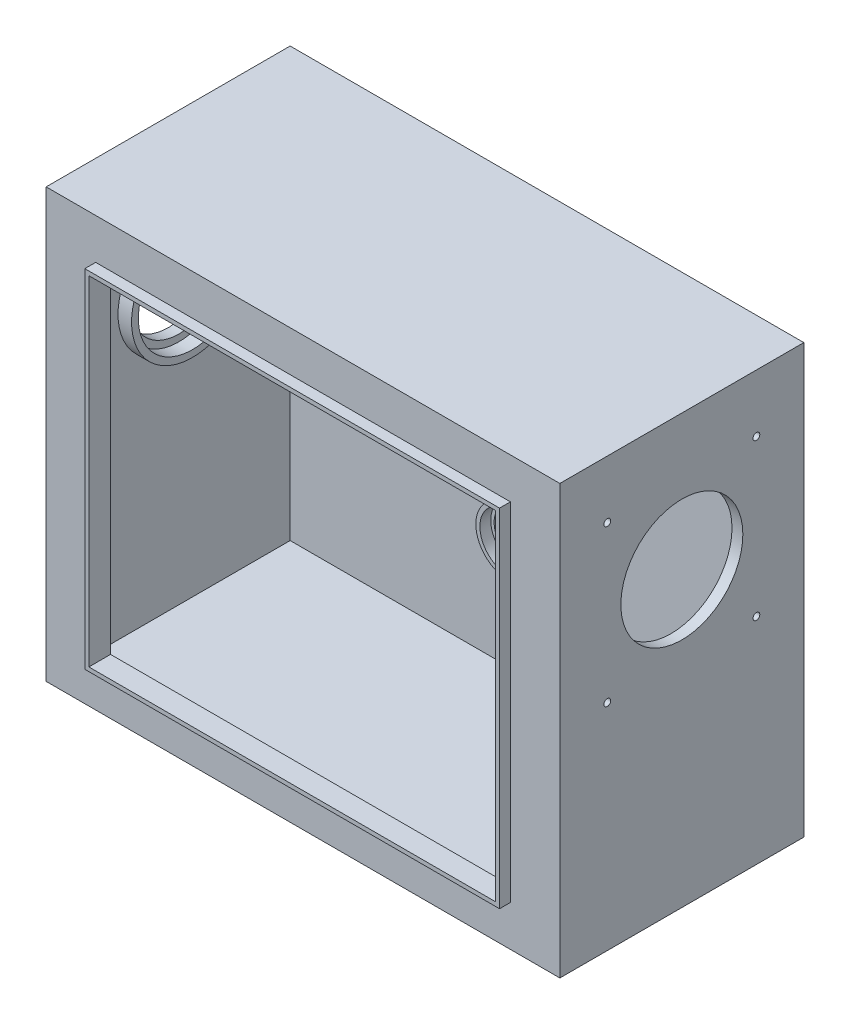
ISO-10303-21;
HEADER;
FILE_DESCRIPTION(('STEP AP214'),'2;1');
FILE_NAME('part.step','',(''),(''),'','','');
FILE_SCHEMA(('AUTOMOTIVE_DESIGN { 1 0 10303 214 1 1 1 1 }'));
ENDSEC;
DATA;
#1=APPLICATION_CONTEXT('core data for automotive mechanical design processes');
#2=APPLICATION_PROTOCOL_DEFINITION('international standard','automotive_design',2000,#1);
#3=PRODUCT_CONTEXT('',#1,'mechanical');
#4=PRODUCT('Part','Part','',(#3));
#5=PRODUCT_RELATED_PRODUCT_CATEGORY('part','',(#4));
#6=PRODUCT_DEFINITION_FORMATION('','',#4);
#7=PRODUCT_DEFINITION_CONTEXT('part definition',#1,'design');
#8=PRODUCT_DEFINITION('design','',#6,#7);
#9=PRODUCT_DEFINITION_SHAPE('','',#8);
#10=(LENGTH_UNIT() NAMED_UNIT(*) SI_UNIT(.MILLI.,.METRE.));
#11=(NAMED_UNIT(*) PLANE_ANGLE_UNIT() SI_UNIT($,.RADIAN.));
#12=(NAMED_UNIT(*) SI_UNIT($,.STERADIAN.) SOLID_ANGLE_UNIT());
#13=UNCERTAINTY_MEASURE_WITH_UNIT(LENGTH_MEASURE(1.E-05),#10,'distance_accuracy_value','');
#14=(GEOMETRIC_REPRESENTATION_CONTEXT(3) GLOBAL_UNCERTAINTY_ASSIGNED_CONTEXT((#13)) GLOBAL_UNIT_ASSIGNED_CONTEXT((#10,
#11,#12)) REPRESENTATION_CONTEXT('',''));
#15=CARTESIAN_POINT('',(0.,0.,0.));
#16=DIRECTION('',(0.,0.,1.));
#17=DIRECTION('',(1.,0.,0.));
#18=AXIS2_PLACEMENT_3D('',#15,#16,#17);
#19=CARTESIAN_POINT('',(-189.5,-158.,180.));
#20=DIRECTION('',(1.,0.,0.));
#21=DIRECTION('',(0.,0.,-1.));
#22=AXIS2_PLACEMENT_3D('',#19,#20,#21);
#23=PLANE('',#22);
#24=CARTESIAN_POINT('',(-189.5,115.5,145.));
#25=DIRECTION('',(-1.,0.,0.));
#26=DIRECTION('',(0.,0.,1.));
#27=AXIS2_PLACEMENT_3D('',#24,#25,#26);
#28=CIRCLE('',#27,2.49999999999999);
#29=CARTESIAN_POINT('',(-189.5,115.5,147.5));
#30=VERTEX_POINT('',#29);
#31=EDGE_CURVE('E331',#30,#30,#28,.T.);
#32=ORIENTED_EDGE('',*,*,#31,.F.);
#33=EDGE_LOOP('',(#32));
#34=FACE_BOUND('',#33,.T.);
#35=CARTESIAN_POINT('',(-189.5,0.49999999999991,145.));
#36=DIRECTION('',(-1.,0.,0.));
#37=DIRECTION('',(0.,0.,1.));
#38=AXIS2_PLACEMENT_3D('',#35,#36,#37);
#39=CIRCLE('',#38,2.49999999999999);
#40=CARTESIAN_POINT('',(-189.5,0.49999999999991,147.5));
#41=VERTEX_POINT('',#40);
#42=EDGE_CURVE('E328',#41,#41,#39,.T.);
#43=ORIENTED_EDGE('',*,*,#42,.F.);
#44=EDGE_LOOP('',(#43));
#45=FACE_BOUND('',#44,.T.);
#46=CARTESIAN_POINT('',(-189.5,0.49999999999991,35.));
#47=DIRECTION('',(-1.,0.,0.));
#48=DIRECTION('',(0.,0.,1.));
#49=AXIS2_PLACEMENT_3D('',#46,#47,#48);
#50=CIRCLE('',#49,2.49999999999999);
#51=CARTESIAN_POINT('',(-189.5,0.49999999999991,37.5));
#52=VERTEX_POINT('',#51);
#53=EDGE_CURVE('E346',#52,#52,#50,.T.);
#54=ORIENTED_EDGE('',*,*,#53,.F.);
#55=EDGE_LOOP('',(#54));
#56=FACE_BOUND('',#55,.T.);
#57=CARTESIAN_POINT('',(-189.5,57.9999999999999,90.));
#58=DIRECTION('',(-1.,0.,0.));
#59=DIRECTION('',(0.,0.,1.));
#60=AXIS2_PLACEMENT_3D('',#57,#58,#59);
#61=CIRCLE('',#60,35.);
#62=CARTESIAN_POINT('',(-189.5,57.9999999999999,125.));
#63=VERTEX_POINT('',#62);
#64=EDGE_CURVE('E247',#63,#63,#61,.T.);
#65=ORIENTED_EDGE('',*,*,#64,.F.);
#66=EDGE_LOOP('',(#65));
#67=FACE_BOUND('',#66,.T.);
#68=DIRECTION('',(0.,-1.,0.));
#69=VECTOR('',#68,1.);
#70=CARTESIAN_POINT('',(-189.5,-158.,0.));
#71=LINE('',#70,#69);
#72=CARTESIAN_POINT('',(-189.5,158.,0.));
#73=VERTEX_POINT('',#72);
#74=CARTESIAN_POINT('',(-189.5,-158.,0.));
#75=VERTEX_POINT('',#74);
#76=EDGE_CURVE('E259',#73,#75,#71,.T.);
#77=ORIENTED_EDGE('',*,*,#76,.T.);
#78=DIRECTION('',(0.,0.,-1.));
#79=VECTOR('',#78,1.);
#80=CARTESIAN_POINT('',(-189.5,-158.,180.));
#81=LINE('',#80,#79);
#82=CARTESIAN_POINT('',(-189.5,-158.,180.));
#83=VERTEX_POINT('',#82);
#84=EDGE_CURVE('E300',#83,#75,#81,.T.);
#85=ORIENTED_EDGE('',*,*,#84,.F.);
#86=DIRECTION('',(0.,-1.,0.));
#87=VECTOR('',#86,1.);
#88=CARTESIAN_POINT('',(-189.5,-158.,180.));
#89=LINE('',#88,#87);
#90=CARTESIAN_POINT('',(-189.5,158.,180.));
#91=VERTEX_POINT('',#90);
#92=EDGE_CURVE('E274',#91,#83,#89,.T.);
#93=ORIENTED_EDGE('',*,*,#92,.F.);
#94=DIRECTION('',(0.,0.,-1.));
#95=VECTOR('',#94,1.);
#96=CARTESIAN_POINT('',(-189.5,158.,180.));
#97=LINE('',#96,#95);
#98=EDGE_CURVE('E284',#91,#73,#97,.T.);
#99=ORIENTED_EDGE('',*,*,#98,.T.);
#100=EDGE_LOOP('',(#77,#85,#93,#99));
#101=FACE_BOUND('',#100,.T.);
#102=CARTESIAN_POINT('',(-189.5,115.5,35.));
#103=DIRECTION('',(-1.,0.,0.));
#104=DIRECTION('',(0.,0.,1.));
#105=AXIS2_PLACEMENT_3D('',#102,#103,#104);
#106=CIRCLE('',#105,2.49999999999999);
#107=CARTESIAN_POINT('',(-189.5,115.5,37.5));
#108=VERTEX_POINT('',#107);
#109=EDGE_CURVE('E398',#108,#108,#106,.T.);
#110=ORIENTED_EDGE('',*,*,#109,.F.);
#111=EDGE_LOOP('',(#110));
#112=FACE_BOUND('',#111,.T.);
#113=ADVANCED_FACE('F37',(#34,#45,#56,#67,#101,#112),#23,.F.);
#114=CARTESIAN_POINT('',(0.,0.,180.));
#115=DIRECTION('',(0.,0.,-1.));
#116=DIRECTION('',(-1.,0.,0.));
#117=AXIS2_PLACEMENT_3D('',#114,#115,#116);
#118=PLANE('',#117);
#119=ORIENTED_EDGE('',*,*,#92,.T.);
#120=DIRECTION('',(1.,0.,0.));
#121=VECTOR('',#120,1.);
#122=CARTESIAN_POINT('',(-189.5,-158.,180.));
#123=LINE('',#122,#121);
#124=CARTESIAN_POINT('',(189.5,-158.,180.));
#125=VERTEX_POINT('',#124);
#126=EDGE_CURVE('E277',#83,#125,#123,.T.);
#127=ORIENTED_EDGE('',*,*,#126,.T.);
#128=DIRECTION('',(0.,1.,0.));
#129=VECTOR('',#128,1.);
#130=CARTESIAN_POINT('',(189.5,-158.,180.));
#131=LINE('',#130,#129);
#132=CARTESIAN_POINT('',(189.5,158.,180.));
#133=VERTEX_POINT('',#132);
#134=EDGE_CURVE('E280',#125,#133,#131,.T.);
#135=ORIENTED_EDGE('',*,*,#134,.T.);
#136=DIRECTION('',(-1.,0.,0.));
#137=VECTOR('',#136,1.);
#138=CARTESIAN_POINT('',(-189.5,158.,180.));
#139=LINE('',#138,#137);
#140=EDGE_CURVE('E282',#133,#91,#139,.T.);
#141=ORIENTED_EDGE('',*,*,#140,.T.);
#142=EDGE_LOOP('',(#119,#127,#135,#141));
#143=FACE_BOUND('',#142,.T.);
#144=DIRECTION('',(0.,-1.,0.));
#145=VECTOR('',#144,1.);
#146=CARTESIAN_POINT('',(-153.,-128.,180.));
#147=LINE('',#146,#145);
#148=CARTESIAN_POINT('',(-153.,128.,180.));
#149=VERTEX_POINT('',#148);
#150=CARTESIAN_POINT('',(-153.,-128.,180.));
#151=VERTEX_POINT('',#150);
#152=EDGE_CURVE('E180',#149,#151,#147,.T.);
#153=ORIENTED_EDGE('',*,*,#152,.F.);
#154=DIRECTION('',(-1.,0.,0.));
#155=VECTOR('',#154,1.);
#156=CARTESIAN_POINT('',(153.,128.,180.));
#157=LINE('',#156,#155);
#158=CARTESIAN_POINT('',(153.,128.,180.));
#159=VERTEX_POINT('',#158);
#160=EDGE_CURVE('E185',#159,#149,#157,.T.);
#161=ORIENTED_EDGE('',*,*,#160,.F.);
#162=DIRECTION('',(0.,1.,0.));
#163=VECTOR('',#162,1.);
#164=CARTESIAN_POINT('',(153.,-128.,180.));
#165=LINE('',#164,#163);
#166=CARTESIAN_POINT('',(153.,-128.,180.));
#167=VERTEX_POINT('',#166);
#168=EDGE_CURVE('E58',#167,#159,#165,.T.);
#169=ORIENTED_EDGE('',*,*,#168,.F.);
#170=DIRECTION('',(1.,0.,0.));
#171=VECTOR('',#170,1.);
#172=CARTESIAN_POINT('',(153.,-128.,180.));
#173=LINE('',#172,#171);
#174=EDGE_CURVE('E53',#151,#167,#173,.T.);
#175=ORIENTED_EDGE('',*,*,#174,.F.);
#176=EDGE_LOOP('',(#153,#161,#169,#175));
#177=FACE_BOUND('',#176,.T.);
#178=ADVANCED_FACE('F377',(#143,#177),#118,.F.);
#179=CARTESIAN_POINT('',(-181.5,-158.,180.));
#180=DIRECTION('',(1.,0.,0.));
#181=DIRECTION('',(0.,0.,-1.));
#182=AXIS2_PLACEMENT_3D('',#179,#180,#181);
#183=PLANE('',#182);
#184=CARTESIAN_POINT('',(-181.5,57.9999999999999,90.));
#185=DIRECTION('',(1.,0.,0.));
#186=DIRECTION('',(0.,0.,-1.));
#187=AXIS2_PLACEMENT_3D('',#184,#185,#186);
#188=CIRCLE('',#187,35.);
#189=CARTESIAN_POINT('',(-181.5,57.9999999999999,55.));
#190=VERTEX_POINT('',#189);
#191=EDGE_CURVE('E252',#190,#190,#188,.T.);
#192=ORIENTED_EDGE('',*,*,#191,.F.);
#193=EDGE_LOOP('',(#192));
#194=FACE_BOUND('',#193,.T.);
#195=CARTESIAN_POINT('',(-181.5,57.9999999999999,90.));
#196=DIRECTION('',(1.,0.,0.));
#197=DIRECTION('',(0.,0.,-1.));
#198=AXIS2_PLACEMENT_3D('',#195,#196,#197);
#199=CIRCLE('',#198,40.);
#200=CARTESIAN_POINT('',(-181.5,57.9999999999999,50.));
#201=VERTEX_POINT('',#200);
#202=EDGE_CURVE('E303',#201,#201,#199,.F.);
#203=ORIENTED_EDGE('',*,*,#202,.F.);
#204=EDGE_LOOP('',(#203));
#205=FACE_BOUND('',#204,.T.);
#206=ADVANCED_FACE('F382',(#194,#205),#183,.T.);
#207=CARTESIAN_POINT('',(-189.5,-158.,180.));
#208=DIRECTION('',(0.,1.,0.));
#209=DIRECTION('',(0.,0.,1.));
#210=AXIS2_PLACEMENT_3D('',#207,#208,#209);
#211=PLANE('',#210);
#212=DIRECTION('',(1.,0.,0.));
#213=VECTOR('',#212,1.);
#214=CARTESIAN_POINT('',(-189.5,-158.,0.));
#215=LINE('',#214,#213);
#216=CARTESIAN_POINT('',(189.5,-158.,0.));
#217=VERTEX_POINT('',#216);
#218=EDGE_CURVE('E287',#75,#217,#215,.T.);
#219=ORIENTED_EDGE('',*,*,#218,.T.);
#220=DIRECTION('',(0.,0.,-1.));
#221=VECTOR('',#220,1.);
#222=CARTESIAN_POINT('',(189.5,-158.,180.));
#223=LINE('',#222,#221);
#224=EDGE_CURVE('E297',#125,#217,#223,.T.);
#225=ORIENTED_EDGE('',*,*,#224,.F.);
#226=ORIENTED_EDGE('',*,*,#126,.F.);
#227=ORIENTED_EDGE('',*,*,#84,.T.);
#228=EDGE_LOOP('',(#219,#225,#226,#227));
#229=FACE_BOUND('',#228,.T.);
#230=ADVANCED_FACE('F442',(#229),#211,.F.);
#231=CARTESIAN_POINT('',(189.5,-158.,180.));
#232=DIRECTION('',(-1.,0.,0.));
#233=DIRECTION('',(0.,0.,1.));
#234=AXIS2_PLACEMENT_3D('',#231,#232,#233);
#235=PLANE('',#234);
#236=CARTESIAN_POINT('',(189.5,115.5,35.));
#237=DIRECTION('',(-1.,0.,0.));
#238=DIRECTION('',(0.,0.,1.));
#239=AXIS2_PLACEMENT_3D('',#236,#237,#238);
#240=CIRCLE('',#239,2.49999999999995);
#241=CARTESIAN_POINT('',(189.5,115.5,37.4999999999999));
#242=VERTEX_POINT('',#241);
#243=EDGE_CURVE('E400',#242,#242,#240,.T.);
#244=ORIENTED_EDGE('',*,*,#243,.T.);
#245=EDGE_LOOP('',(#244));
#246=FACE_BOUND('',#245,.T.);
#247=CARTESIAN_POINT('',(189.5,115.5,145.));
#248=DIRECTION('',(-1.,0.,0.));
#249=DIRECTION('',(0.,0.,1.));
#250=AXIS2_PLACEMENT_3D('',#247,#248,#249);
#251=CIRCLE('',#250,2.49999999999995);
#252=CARTESIAN_POINT('',(189.5,115.5,147.5));
#253=VERTEX_POINT('',#252);
#254=EDGE_CURVE('E324',#253,#253,#251,.T.);
#255=ORIENTED_EDGE('',*,*,#254,.T.);
#256=EDGE_LOOP('',(#255));
#257=FACE_BOUND('',#256,.T.);
#258=CARTESIAN_POINT('',(189.5,0.49999999999991,145.));
#259=DIRECTION('',(-1.,0.,0.));
#260=DIRECTION('',(0.,0.,1.));
#261=AXIS2_PLACEMENT_3D('',#258,#259,#260);
#262=CIRCLE('',#261,2.49999999999995);
#263=CARTESIAN_POINT('',(189.5,0.49999999999991,147.5));
#264=VERTEX_POINT('',#263);
#265=EDGE_CURVE('E320',#264,#264,#262,.T.);
#266=ORIENTED_EDGE('',*,*,#265,.T.);
#267=EDGE_LOOP('',(#266));
#268=FACE_BOUND('',#267,.T.);
#269=CARTESIAN_POINT('',(189.5,0.49999999999991,35.));
#270=DIRECTION('',(-1.,0.,0.));
#271=DIRECTION('',(0.,0.,1.));
#272=AXIS2_PLACEMENT_3D('',#269,#270,#271);
#273=CIRCLE('',#272,2.49999999999995);
#274=CARTESIAN_POINT('',(189.5,0.49999999999991,37.4999999999999));
#275=VERTEX_POINT('',#274);
#276=EDGE_CURVE('E316',#275,#275,#273,.T.);
#277=ORIENTED_EDGE('',*,*,#276,.T.);
#278=EDGE_LOOP('',(#277));
#279=FACE_BOUND('',#278,.T.);
#280=CARTESIAN_POINT('',(189.5,58.,90.));
#281=DIRECTION('',(1.,0.,0.));
#282=DIRECTION('',(0.,0.,-1.));
#283=AXIS2_PLACEMENT_3D('',#280,#281,#282);
#284=CIRCLE('',#283,45.);
#285=CARTESIAN_POINT('',(189.5,58.,45.));
#286=VERTEX_POINT('',#285);
#287=EDGE_CURVE('E236',#286,#286,#284,.T.);
#288=ORIENTED_EDGE('',*,*,#287,.F.);
#289=EDGE_LOOP('',(#288));
#290=FACE_BOUND('',#289,.T.);
#291=DIRECTION('',(0.,1.,0.));
#292=VECTOR('',#291,1.);
#293=CARTESIAN_POINT('',(189.5,-158.,0.));
#294=LINE('',#293,#292);
#295=CARTESIAN_POINT('',(189.5,158.,0.));
#296=VERTEX_POINT('',#295);
#297=EDGE_CURVE('E289',#217,#296,#294,.T.);
#298=ORIENTED_EDGE('',*,*,#297,.T.);
#299=DIRECTION('',(0.,0.,-1.));
#300=VECTOR('',#299,1.);
#301=CARTESIAN_POINT('',(189.5,158.,180.));
#302=LINE('',#301,#300);
#303=EDGE_CURVE('E294',#133,#296,#302,.T.);
#304=ORIENTED_EDGE('',*,*,#303,.F.);
#305=ORIENTED_EDGE('',*,*,#134,.F.);
#306=ORIENTED_EDGE('',*,*,#224,.T.);
#307=EDGE_LOOP('',(#298,#304,#305,#306));
#308=FACE_BOUND('',#307,.T.);
#309=ADVANCED_FACE('F438',(#246,#257,#268,#279,#290,#308),#235,.F.);
#310=CARTESIAN_POINT('',(-189.5,158.,180.));
#311=DIRECTION('',(0.,-1.,0.));
#312=DIRECTION('',(0.,0.,-1.));
#313=AXIS2_PLACEMENT_3D('',#310,#311,#312);
#314=PLANE('',#313);
#315=DIRECTION('',(-1.,0.,0.));
#316=VECTOR('',#315,1.);
#317=CARTESIAN_POINT('',(-189.5,158.,0.));
#318=LINE('',#317,#316);
#319=EDGE_CURVE('E278',#296,#73,#318,.T.);
#320=ORIENTED_EDGE('',*,*,#319,.T.);
#321=ORIENTED_EDGE('',*,*,#98,.F.);
#322=ORIENTED_EDGE('',*,*,#140,.F.);
#323=ORIENTED_EDGE('',*,*,#303,.T.);
#324=EDGE_LOOP('',(#320,#321,#322,#323));
#325=FACE_BOUND('',#324,.T.);
#326=ADVANCED_FACE('F441',(#325),#314,.F.);
#327=CARTESIAN_POINT('',(0.,0.,0.));
#328=DIRECTION('',(0.,0.,-1.));
#329=DIRECTION('',(-1.,0.,0.));
#330=AXIS2_PLACEMENT_3D('',#327,#328,#329);
#331=PLANE('',#330);
#332=ORIENTED_EDGE('',*,*,#76,.F.);
#333=ORIENTED_EDGE('',*,*,#319,.F.);
#334=ORIENTED_EDGE('',*,*,#297,.F.);
#335=ORIENTED_EDGE('',*,*,#218,.F.);
#336=EDGE_LOOP('',(#332,#333,#334,#335));
#337=FACE_BOUND('',#336,.T.);
#338=ADVANCED_FACE('F454',(#337),#331,.T.);
#339=CARTESIAN_POINT('',(-181.5,115.5,35.));
#340=DIRECTION('',(1.,0.,0.));
#341=DIRECTION('',(0.,0.,-1.));
#342=AXIS2_PLACEMENT_3D('',#339,#340,#341);
#343=CIRCLE('',#342,2.49999999999997);
#344=CARTESIAN_POINT('',(-181.5,115.5,32.5));
#345=VERTEX_POINT('',#344);
#346=EDGE_CURVE('E336',#345,#345,#343,.T.);
#347=ORIENTED_EDGE('',*,*,#346,.F.);
#348=EDGE_LOOP('',(#347));
#349=FACE_BOUND('',#348,.T.);
#350=CARTESIAN_POINT('',(-181.5,115.5,145.));
#351=DIRECTION('',(1.,0.,0.));
#352=DIRECTION('',(0.,0.,-1.));
#353=AXIS2_PLACEMENT_3D('',#350,#351,#352);
#354=CIRCLE('',#353,2.49999999999997);
#355=CARTESIAN_POINT('',(-181.5,115.5,142.5));
#356=VERTEX_POINT('',#355);
#357=EDGE_CURVE('E323',#356,#356,#354,.T.);
#358=ORIENTED_EDGE('',*,*,#357,.F.);
#359=EDGE_LOOP('',(#358));
#360=FACE_BOUND('',#359,.T.);
#361=CARTESIAN_POINT('',(-181.5,0.49999999999991,145.));
#362=DIRECTION('',(1.,0.,0.));
#363=DIRECTION('',(0.,0.,-1.));
#364=AXIS2_PLACEMENT_3D('',#361,#362,#363);
#365=CIRCLE('',#364,2.49999999999997);
#366=CARTESIAN_POINT('',(-181.5,0.49999999999991,142.5));
#367=VERTEX_POINT('',#366);
#368=EDGE_CURVE('E319',#367,#367,#365,.T.);
#369=ORIENTED_EDGE('',*,*,#368,.F.);
#370=EDGE_LOOP('',(#369));
#371=FACE_BOUND('',#370,.T.);
#372=CARTESIAN_POINT('',(-181.5,0.49999999999991,35.));
#373=DIRECTION('',(1.,0.,0.));
#374=DIRECTION('',(0.,0.,-1.));
#375=AXIS2_PLACEMENT_3D('',#372,#373,#374);
#376=CIRCLE('',#375,2.49999999999997);
#377=CARTESIAN_POINT('',(-181.5,0.49999999999991,32.5));
#378=VERTEX_POINT('',#377);
#379=EDGE_CURVE('E315',#378,#378,#376,.T.);
#380=ORIENTED_EDGE('',*,*,#379,.F.);
#381=EDGE_LOOP('',(#380));
#382=FACE_BOUND('',#381,.T.);
#383=DIRECTION('',(0.,-1.,0.));
#384=VECTOR('',#383,1.);
#385=CARTESIAN_POINT('',(-181.5,150.,172.));
#386=LINE('',#385,#384);
#387=CARTESIAN_POINT('',(-181.5,150.,172.));
#388=VERTEX_POINT('',#387);
#389=CARTESIAN_POINT('',(-181.5,-150.,172.));
#390=VERTEX_POINT('',#389);
#391=EDGE_CURVE('E218',#388,#390,#386,.T.);
#392=ORIENTED_EDGE('',*,*,#391,.T.);
#393=DIRECTION('',(0.,0.,-1.));
#394=VECTOR('',#393,1.);
#395=CARTESIAN_POINT('',(-181.5,-150.,180.));
#396=LINE('',#395,#394);
#397=CARTESIAN_POINT('',(-181.5,-150.,8.));
#398=VERTEX_POINT('',#397);
#399=EDGE_CURVE('E257',#390,#398,#396,.T.);
#400=ORIENTED_EDGE('',*,*,#399,.T.);
#401=DIRECTION('',(0.,-1.,0.));
#402=VECTOR('',#401,1.);
#403=CARTESIAN_POINT('',(-181.5,0.,8.));
#404=LINE('',#403,#402);
#405=CARTESIAN_POINT('',(-181.5,150.,8.));
#406=VERTEX_POINT('',#405);
#407=EDGE_CURVE('E253',#406,#398,#404,.T.);
#408=ORIENTED_EDGE('',*,*,#407,.F.);
#409=DIRECTION('',(0.,0.,-1.));
#410=VECTOR('',#409,1.);
#411=CARTESIAN_POINT('',(-181.5,150.,180.));
#412=LINE('',#411,#410);
#413=EDGE_CURVE('E261',#388,#406,#412,.T.);
#414=ORIENTED_EDGE('',*,*,#413,.F.);
#415=EDGE_LOOP('',(#392,#400,#408,#414));
#416=FACE_BOUND('',#415,.T.);
#417=CARTESIAN_POINT('',(-181.5,57.9999999999999,90.));
#418=DIRECTION('',(1.,0.,0.));
#419=DIRECTION('',(0.,0.,-1.));
#420=AXIS2_PLACEMENT_3D('',#417,#418,#419);
#421=CIRCLE('',#420,45.);
#422=CARTESIAN_POINT('',(-181.5,57.9999999999999,45.));
#423=VERTEX_POINT('',#422);
#424=EDGE_CURVE('E243',#423,#423,#421,.T.);
#425=ORIENTED_EDGE('',*,*,#424,.F.);
#426=EDGE_LOOP('',(#425));
#427=FACE_BOUND('',#426,.T.);
#428=ADVANCED_FACE('F524',(#349,#360,#371,#382,#416,#427),#183,.T.);
#429=CARTESIAN_POINT('',(-189.5,-150.,180.));
#430=DIRECTION('',(0.,1.,0.));
#431=DIRECTION('',(0.,0.,1.));
#432=AXIS2_PLACEMENT_3D('',#429,#430,#431);
#433=PLANE('',#432);
#434=DIRECTION('',(1.,0.,0.));
#435=VECTOR('',#434,1.);
#436=CARTESIAN_POINT('',(181.5,-150.,172.));
#437=LINE('',#436,#435);
#438=CARTESIAN_POINT('',(181.5,-150.,172.));
#439=VERTEX_POINT('',#438);
#440=EDGE_CURVE('E223',#390,#439,#437,.T.);
#441=ORIENTED_EDGE('',*,*,#440,.T.);
#442=DIRECTION('',(0.,0.,-1.));
#443=VECTOR('',#442,1.);
#444=CARTESIAN_POINT('',(181.5,-150.,180.));
#445=LINE('',#444,#443);
#446=CARTESIAN_POINT('',(181.5,-150.,8.));
#447=VERTEX_POINT('',#446);
#448=EDGE_CURVE('E260',#439,#447,#445,.T.);
#449=ORIENTED_EDGE('',*,*,#448,.T.);
#450=DIRECTION('',(1.,0.,0.));
#451=VECTOR('',#450,1.);
#452=CARTESIAN_POINT('',(0.,-150.,8.));
#453=LINE('',#452,#451);
#454=EDGE_CURVE('E256',#398,#447,#453,.T.);
#455=ORIENTED_EDGE('',*,*,#454,.F.);
#456=ORIENTED_EDGE('',*,*,#399,.F.);
#457=EDGE_LOOP('',(#441,#449,#455,#456));
#458=FACE_BOUND('',#457,.T.);
#459=ADVANCED_FACE('F417',(#458),#433,.T.);
#460=CARTESIAN_POINT('',(181.5,-158.,180.));
#461=DIRECTION('',(-1.,0.,0.));
#462=DIRECTION('',(0.,0.,1.));
#463=AXIS2_PLACEMENT_3D('',#460,#461,#462);
#464=PLANE('',#463);
#465=CARTESIAN_POINT('',(181.5,115.5,35.));
#466=DIRECTION('',(-1.,0.,0.));
#467=DIRECTION('',(0.,0.,1.));
#468=AXIS2_PLACEMENT_3D('',#465,#466,#467);
#469=CIRCLE('',#468,2.49999999999997);
#470=CARTESIAN_POINT('',(181.5,115.5,37.5));
#471=VERTEX_POINT('',#470);
#472=EDGE_CURVE('E40',#471,#471,#469,.T.);
#473=ORIENTED_EDGE('',*,*,#472,.F.);
#474=EDGE_LOOP('',(#473));
#475=FACE_BOUND('',#474,.T.);
#476=CARTESIAN_POINT('',(181.5,115.5,145.));
#477=DIRECTION('',(-1.,0.,0.));
#478=DIRECTION('',(0.,0.,1.));
#479=AXIS2_PLACEMENT_3D('',#476,#477,#478);
#480=CIRCLE('',#479,2.49999999999997);
#481=CARTESIAN_POINT('',(181.5,115.5,147.5));
#482=VERTEX_POINT('',#481);
#483=EDGE_CURVE('E321',#482,#482,#480,.T.);
#484=ORIENTED_EDGE('',*,*,#483,.F.);
#485=EDGE_LOOP('',(#484));
#486=FACE_BOUND('',#485,.T.);
#487=CARTESIAN_POINT('',(181.5,0.49999999999991,145.));
#488=DIRECTION('',(-1.,0.,0.));
#489=DIRECTION('',(0.,0.,1.));
#490=AXIS2_PLACEMENT_3D('',#487,#488,#489);
#491=CIRCLE('',#490,2.49999999999997);
#492=CARTESIAN_POINT('',(181.5,0.49999999999991,147.5));
#493=VERTEX_POINT('',#492);
#494=EDGE_CURVE('E317',#493,#493,#491,.T.);
#495=ORIENTED_EDGE('',*,*,#494,.F.);
#496=EDGE_LOOP('',(#495));
#497=FACE_BOUND('',#496,.T.);
#498=CARTESIAN_POINT('',(181.5,0.49999999999991,35.));
#499=DIRECTION('',(-1.,0.,0.));
#500=DIRECTION('',(0.,0.,1.));
#501=AXIS2_PLACEMENT_3D('',#498,#499,#500);
#502=CIRCLE('',#501,2.49999999999997);
#503=CARTESIAN_POINT('',(181.5,0.49999999999991,37.5));
#504=VERTEX_POINT('',#503);
#505=EDGE_CURVE('E312',#504,#504,#502,.T.);
#506=ORIENTED_EDGE('',*,*,#505,.F.);
#507=EDGE_LOOP('',(#506));
#508=FACE_BOUND('',#507,.T.);
#509=DIRECTION('',(0.,1.,0.));
#510=VECTOR('',#509,1.);
#511=CARTESIAN_POINT('',(181.5,150.,172.));
#512=LINE('',#511,#510);
#513=CARTESIAN_POINT('',(181.5,150.,172.));
#514=VERTEX_POINT('',#513);
#515=EDGE_CURVE('E225',#439,#514,#512,.T.);
#516=ORIENTED_EDGE('',*,*,#515,.T.);
#517=DIRECTION('',(0.,0.,-1.));
#518=VECTOR('',#517,1.);
#519=CARTESIAN_POINT('',(181.5,150.,180.));
#520=LINE('',#519,#518);
#521=CARTESIAN_POINT('',(181.5,150.,8.));
#522=VERTEX_POINT('',#521);
#523=EDGE_CURVE('E263',#514,#522,#520,.T.);
#524=ORIENTED_EDGE('',*,*,#523,.T.);
#525=DIRECTION('',(0.,1.,0.));
#526=VECTOR('',#525,1.);
#527=CARTESIAN_POINT('',(181.5,0.,8.));
#528=LINE('',#527,#526);
#529=EDGE_CURVE('E267',#447,#522,#528,.T.);
#530=ORIENTED_EDGE('',*,*,#529,.F.);
#531=ORIENTED_EDGE('',*,*,#448,.F.);
#532=EDGE_LOOP('',(#516,#524,#530,#531));
#533=FACE_BOUND('',#532,.T.);
#534=CARTESIAN_POINT('',(181.5,58.,90.));
#535=DIRECTION('',(-1.,0.,0.));
#536=DIRECTION('',(0.,0.,1.));
#537=AXIS2_PLACEMENT_3D('',#534,#535,#536);
#538=CIRCLE('',#537,45.);
#539=CARTESIAN_POINT('',(181.5,58.,135.));
#540=VERTEX_POINT('',#539);
#541=EDGE_CURVE('E239',#540,#540,#538,.T.);
#542=ORIENTED_EDGE('',*,*,#541,.F.);
#543=EDGE_LOOP('',(#542));
#544=FACE_BOUND('',#543,.T.);
#545=ADVANCED_FACE('F413',(#475,#486,#497,#508,#533,#544),#464,.T.);
#546=CARTESIAN_POINT('',(-189.5,150.,180.));
#547=DIRECTION('',(0.,-1.,0.));
#548=DIRECTION('',(0.,0.,-1.));
#549=AXIS2_PLACEMENT_3D('',#546,#547,#548);
#550=PLANE('',#549);
#551=DIRECTION('',(-1.,0.,0.));
#552=VECTOR('',#551,1.);
#553=CARTESIAN_POINT('',(181.5,150.,172.));
#554=LINE('',#553,#552);
#555=EDGE_CURVE('E228',#514,#388,#554,.T.);
#556=ORIENTED_EDGE('',*,*,#555,.T.);
#557=ORIENTED_EDGE('',*,*,#413,.T.);
#558=DIRECTION('',(-1.,0.,0.));
#559=VECTOR('',#558,1.);
#560=CARTESIAN_POINT('',(0.,150.,8.));
#561=LINE('',#560,#559);
#562=EDGE_CURVE('E264',#522,#406,#561,.T.);
#563=ORIENTED_EDGE('',*,*,#562,.F.);
#564=ORIENTED_EDGE('',*,*,#523,.F.);
#565=EDGE_LOOP('',(#556,#557,#563,#564));
#566=FACE_BOUND('',#565,.T.);
#567=ADVANCED_FACE('F416',(#566),#550,.T.);
#568=CARTESIAN_POINT('',(0.,0.,8.));
#569=DIRECTION('',(0.,0.,-1.));
#570=DIRECTION('',(-1.,0.,0.));
#571=AXIS2_PLACEMENT_3D('',#568,#569,#570);
#572=PLANE('',#571);
#573=CARTESIAN_POINT('',(-2.50000000000001,-53.0000000000001,8.));
#574=DIRECTION('',(0.,0.,-1.));
#575=DIRECTION('',(-1.,0.,0.));
#576=AXIS2_PLACEMENT_3D('',#573,#574,#575);
#577=CIRCLE('',#576,24.);
#578=CARTESIAN_POINT('',(-26.5,-53.0000000000001,8.));
#579=VERTEX_POINT('',#578);
#580=EDGE_CURVE('E45',#579,#579,#577,.F.);
#581=ORIENTED_EDGE('',*,*,#580,.F.);
#582=EDGE_LOOP('',(#581));
#583=FACE_BOUND('',#582,.T.);
#584=ORIENTED_EDGE('',*,*,#407,.T.);
#585=ORIENTED_EDGE('',*,*,#454,.T.);
#586=ORIENTED_EDGE('',*,*,#529,.T.);
#587=ORIENTED_EDGE('',*,*,#562,.T.);
#588=EDGE_LOOP('',(#584,#585,#586,#587));
#589=FACE_BOUND('',#588,.T.);
#590=ADVANCED_FACE('F371',(#583,#589),#572,.F.);
#591=CARTESIAN_POINT('',(-169.5,57.9999999999999,90.));
#592=DIRECTION('',(-1.,0.,0.));
#593=DIRECTION('',(0.,0.,1.));
#594=AXIS2_PLACEMENT_3D('',#591,#592,#593);
#595=CYLINDRICAL_SURFACE('',#594,35.);
#596=ORIENTED_EDGE('',*,*,#191,.T.);
#597=EDGE_LOOP('',(#596));
#598=FACE_BOUND('',#597,.T.);
#599=ORIENTED_EDGE('',*,*,#64,.T.);
#600=EDGE_LOOP('',(#599));
#601=FACE_BOUND('',#600,.T.);
#602=ADVANCED_FACE('F516',(#598,#601),#595,.F.);
#603=CARTESIAN_POINT('',(-171.5,57.9999999999999,90.));
#604=DIRECTION('',(1.,0.,0.));
#605=DIRECTION('',(0.,0.,-1.));
#606=AXIS2_PLACEMENT_3D('',#603,#604,#605);
#607=PLANE('',#606);
#608=CARTESIAN_POINT('',(-171.5,57.9999999999999,90.));
#609=DIRECTION('',(1.,0.,0.));
#610=DIRECTION('',(0.,0.,-1.));
#611=AXIS2_PLACEMENT_3D('',#608,#609,#610);
#612=CIRCLE('',#611,45.);
#613=CARTESIAN_POINT('',(-171.5,57.9999999999999,45.));
#614=VERTEX_POINT('',#613);
#615=EDGE_CURVE('E244',#614,#614,#612,.T.);
#616=ORIENTED_EDGE('',*,*,#615,.T.);
#617=EDGE_LOOP('',(#616));
#618=FACE_BOUND('',#617,.T.);
#619=CARTESIAN_POINT('',(-171.5,57.9999999999999,90.));
#620=DIRECTION('',(1.,0.,0.));
#621=DIRECTION('',(0.,0.,-1.));
#622=AXIS2_PLACEMENT_3D('',#619,#620,#621);
#623=CIRCLE('',#622,40.);
#624=CARTESIAN_POINT('',(-171.5,57.9999999999999,50.));
#625=VERTEX_POINT('',#624);
#626=EDGE_CURVE('E240',#625,#625,#623,.T.);
#627=ORIENTED_EDGE('',*,*,#626,.F.);
#628=EDGE_LOOP('',(#627));
#629=FACE_BOUND('',#628,.T.);
#630=ADVANCED_FACE('F513',(#618,#629),#607,.T.);
#631=CARTESIAN_POINT('',(-171.5,57.9999999999999,90.));
#632=DIRECTION('',(-1.,0.,0.));
#633=DIRECTION('',(0.,0.,1.));
#634=AXIS2_PLACEMENT_3D('',#631,#632,#633);
#635=CYLINDRICAL_SURFACE('',#634,45.);
#636=ORIENTED_EDGE('',*,*,#615,.F.);
#637=EDGE_LOOP('',(#636));
#638=FACE_BOUND('',#637,.T.);
#639=ORIENTED_EDGE('',*,*,#424,.T.);
#640=EDGE_LOOP('',(#639));
#641=FACE_BOUND('',#640,.T.);
#642=ADVANCED_FACE('F511',(#638,#641),#635,.T.);
#643=CARTESIAN_POINT('',(-171.5,57.9999999999999,90.));
#644=DIRECTION('',(-1.,0.,0.));
#645=DIRECTION('',(0.,0.,1.));
#646=AXIS2_PLACEMENT_3D('',#643,#644,#645);
#647=CYLINDRICAL_SURFACE('',#646,40.);
#648=ORIENTED_EDGE('',*,*,#626,.T.);
#649=EDGE_LOOP('',(#648));
#650=FACE_BOUND('',#649,.T.);
#651=ORIENTED_EDGE('',*,*,#202,.T.);
#652=EDGE_LOOP('',(#651));
#653=FACE_BOUND('',#652,.T.);
#654=ADVANCED_FACE('F434',(#650,#653),#647,.F.);
#655=CARTESIAN_POINT('',(179.5,58.,90.));
#656=DIRECTION('',(1.,0.,0.));
#657=DIRECTION('',(0.,0.,-1.));
#658=AXIS2_PLACEMENT_3D('',#655,#656,#657);
#659=CYLINDRICAL_SURFACE('',#658,45.);
#660=ORIENTED_EDGE('',*,*,#541,.T.);
#661=EDGE_LOOP('',(#660));
#662=FACE_BOUND('',#661,.T.);
#663=ORIENTED_EDGE('',*,*,#287,.T.);
#664=EDGE_LOOP('',(#663));
#665=FACE_BOUND('',#664,.T.);
#666=ADVANCED_FACE('F430',(#662,#665),#659,.F.);
#667=CARTESIAN_POINT('',(-2.50000000000001,-53.0000000000001,26.));
#668=DIRECTION('',(0.,0.,1.));
#669=DIRECTION('',(1.,0.,0.));
#670=AXIS2_PLACEMENT_3D('',#667,#668,#669);
#671=PLANE('',#670);
#672=CARTESIAN_POINT('',(-2.50000000000001,-53.0000000000001,26.));
#673=DIRECTION('',(0.,0.,1.));
#674=DIRECTION('',(1.,0.,0.));
#675=AXIS2_PLACEMENT_3D('',#672,#673,#674);
#676=CIRCLE('',#675,24.);
#677=CARTESIAN_POINT('',(21.5,-53.0000000000001,26.));
#678=VERTEX_POINT('',#677);
#679=EDGE_CURVE('E233',#678,#678,#676,.T.);
#680=ORIENTED_EDGE('',*,*,#679,.T.);
#681=EDGE_LOOP('',(#680));
#682=FACE_BOUND('',#681,.T.);
#683=CARTESIAN_POINT('',(-2.50000000000001,-53.0000000000001,26.));
#684=DIRECTION('',(0.,0.,1.));
#685=DIRECTION('',(1.,0.,0.));
#686=AXIS2_PLACEMENT_3D('',#683,#684,#685);
#687=CIRCLE('',#686,20.9999999999994);
#688=CARTESIAN_POINT('',(18.4999999999994,-53.0000000000001,26.));
#689=VERTEX_POINT('',#688);
#690=EDGE_CURVE('E230',#689,#689,#687,.T.);
#691=ORIENTED_EDGE('',*,*,#690,.F.);
#692=EDGE_LOOP('',(#691));
#693=FACE_BOUND('',#692,.T.);
#694=ADVANCED_FACE('F433',(#682,#693),#671,.T.);
#695=CARTESIAN_POINT('',(-2.50000000000001,-53.0000000000001,26.));
#696=DIRECTION('',(0.,0.,-1.));
#697=DIRECTION('',(-1.,0.,0.));
#698=AXIS2_PLACEMENT_3D('',#695,#696,#697);
#699=CYLINDRICAL_SURFACE('',#698,24.);
#700=ORIENTED_EDGE('',*,*,#679,.F.);
#701=EDGE_LOOP('',(#700));
#702=FACE_BOUND('',#701,.T.);
#703=ORIENTED_EDGE('',*,*,#580,.T.);
#704=EDGE_LOOP('',(#703));
#705=FACE_BOUND('',#704,.T.);
#706=ADVANCED_FACE('F501',(#702,#705),#699,.T.);
#707=CARTESIAN_POINT('',(-2.50000000000001,-53.0000000000001,26.));
#708=DIRECTION('',(0.,0.,-1.));
#709=DIRECTION('',(-1.,0.,0.));
#710=AXIS2_PLACEMENT_3D('',#707,#708,#709);
#711=CYLINDRICAL_SURFACE('',#710,20.9999999999994);
#712=CARTESIAN_POINT('',(-2.50000000000001,-53.0000000000001,18.));
#713=DIRECTION('',(0.,0.,1.));
#714=DIRECTION('',(1.,0.,0.));
#715=AXIS2_PLACEMENT_3D('',#712,#713,#714);
#716=CIRCLE('',#715,20.9999999999994);
#717=CARTESIAN_POINT('',(18.4999999999994,-53.0000000000001,18.));
#718=VERTEX_POINT('',#717);
#719=EDGE_CURVE('E11',#718,#718,#716,.T.);
#720=ORIENTED_EDGE('',*,*,#719,.F.);
#721=EDGE_LOOP('',(#720));
#722=FACE_BOUND('',#721,.T.);
#723=ORIENTED_EDGE('',*,*,#690,.T.);
#724=EDGE_LOOP('',(#723));
#725=FACE_BOUND('',#724,.T.);
#726=ADVANCED_FACE('F497',(#722,#725),#711,.F.);
#727=CARTESIAN_POINT('',(0.,0.,172.));
#728=DIRECTION('',(0.,0.,-1.));
#729=DIRECTION('',(-1.,0.,0.));
#730=AXIS2_PLACEMENT_3D('',#727,#728,#729);
#731=PLANE('',#730);
#732=DIRECTION('',(0.,1.,0.));
#733=VECTOR('',#732,1.);
#734=CARTESIAN_POINT('',(150.,125.,172.));
#735=LINE('',#734,#733);
#736=CARTESIAN_POINT('',(150.,-125.,172.));
#737=VERTEX_POINT('',#736);
#738=CARTESIAN_POINT('',(150.,125.,172.));
#739=VERTEX_POINT('',#738);
#740=EDGE_CURVE('E208',#737,#739,#735,.T.);
#741=ORIENTED_EDGE('',*,*,#740,.T.);
#742=DIRECTION('',(-1.,0.,0.));
#743=VECTOR('',#742,1.);
#744=CARTESIAN_POINT('',(-150.,125.,172.));
#745=LINE('',#744,#743);
#746=CARTESIAN_POINT('',(-150.,125.,172.));
#747=VERTEX_POINT('',#746);
#748=EDGE_CURVE('E211',#739,#747,#745,.T.);
#749=ORIENTED_EDGE('',*,*,#748,.T.);
#750=DIRECTION('',(0.,-1.,0.));
#751=VECTOR('',#750,1.);
#752=CARTESIAN_POINT('',(-150.,125.,172.));
#753=LINE('',#752,#751);
#754=CARTESIAN_POINT('',(-150.,-125.,172.));
#755=VERTEX_POINT('',#754);
#756=EDGE_CURVE('E214',#747,#755,#753,.T.);
#757=ORIENTED_EDGE('',*,*,#756,.T.);
#758=DIRECTION('',(1.,0.,0.));
#759=VECTOR('',#758,1.);
#760=CARTESIAN_POINT('',(-150.,-125.,172.));
#761=LINE('',#760,#759);
#762=EDGE_CURVE('E156',#755,#737,#761,.T.);
#763=ORIENTED_EDGE('',*,*,#762,.T.);
#764=EDGE_LOOP('',(#741,#749,#757,#763));
#765=FACE_BOUND('',#764,.T.);
#766=ORIENTED_EDGE('',*,*,#391,.F.);
#767=ORIENTED_EDGE('',*,*,#555,.F.);
#768=ORIENTED_EDGE('',*,*,#515,.F.);
#769=ORIENTED_EDGE('',*,*,#440,.F.);
#770=EDGE_LOOP('',(#766,#767,#768,#769));
#771=FACE_BOUND('',#770,.T.);
#772=ADVANCED_FACE('F493',(#765,#771),#731,.T.);
#773=CARTESIAN_POINT('',(150.,125.,172.));
#774=DIRECTION('',(1.,0.,0.));
#775=DIRECTION('',(0.,0.,-1.));
#776=AXIS2_PLACEMENT_3D('',#773,#774,#775);
#777=PLANE('',#776);
#778=DIRECTION('',(0.,0.,1.));
#779=VECTOR('',#778,1.);
#780=CARTESIAN_POINT('',(150.,-125.,172.));
#781=LINE('',#780,#779);
#782=CARTESIAN_POINT('',(150.,-125.,188.));
#783=VERTEX_POINT('',#782);
#784=EDGE_CURVE('E159',#737,#783,#781,.T.);
#785=ORIENTED_EDGE('',*,*,#784,.T.);
#786=DIRECTION('',(0.,1.,0.));
#787=VECTOR('',#786,1.);
#788=CARTESIAN_POINT('',(150.,-125.,188.));
#789=LINE('',#788,#787);
#790=CARTESIAN_POINT('',(150.,125.,188.));
#791=VERTEX_POINT('',#790);
#792=EDGE_CURVE('E173',#783,#791,#789,.T.);
#793=ORIENTED_EDGE('',*,*,#792,.T.);
#794=DIRECTION('',(0.,0.,1.));
#795=VECTOR('',#794,1.);
#796=CARTESIAN_POINT('',(150.,125.,172.));
#797=LINE('',#796,#795);
#798=EDGE_CURVE('E217',#739,#791,#797,.T.);
#799=ORIENTED_EDGE('',*,*,#798,.F.);
#800=ORIENTED_EDGE('',*,*,#740,.F.);
#801=EDGE_LOOP('',(#785,#793,#799,#800));
#802=FACE_BOUND('',#801,.T.);
#803=ADVANCED_FACE('F484',(#802),#777,.F.);
#804=CARTESIAN_POINT('',(-150.,-125.,172.));
#805=DIRECTION('',(0.,-1.,0.));
#806=DIRECTION('',(0.,0.,-1.));
#807=AXIS2_PLACEMENT_3D('',#804,#805,#806);
#808=PLANE('',#807);
#809=DIRECTION('',(0.,0.,1.));
#810=VECTOR('',#809,1.);
#811=CARTESIAN_POINT('',(-150.,-125.,172.));
#812=LINE('',#811,#810);
#813=CARTESIAN_POINT('',(-150.,-125.,188.));
#814=VERTEX_POINT('',#813);
#815=EDGE_CURVE('E149',#755,#814,#812,.T.);
#816=ORIENTED_EDGE('',*,*,#815,.T.);
#817=DIRECTION('',(1.,0.,0.));
#818=VECTOR('',#817,1.);
#819=CARTESIAN_POINT('',(150.,-125.,188.));
#820=LINE('',#819,#818);
#821=EDGE_CURVE('E153',#814,#783,#820,.T.);
#822=ORIENTED_EDGE('',*,*,#821,.T.);
#823=ORIENTED_EDGE('',*,*,#784,.F.);
#824=ORIENTED_EDGE('',*,*,#762,.F.);
#825=EDGE_LOOP('',(#816,#822,#823,#824));
#826=FACE_BOUND('',#825,.T.);
#827=ADVANCED_FACE('F151',(#826),#808,.F.);
#828=CARTESIAN_POINT('',(-150.,125.,172.));
#829=DIRECTION('',(-1.,0.,0.));
#830=DIRECTION('',(0.,0.,1.));
#831=AXIS2_PLACEMENT_3D('',#828,#829,#830);
#832=PLANE('',#831);
#833=DIRECTION('',(0.,0.,1.));
#834=VECTOR('',#833,1.);
#835=CARTESIAN_POINT('',(-150.,125.,172.));
#836=LINE('',#835,#834);
#837=CARTESIAN_POINT('',(-150.,125.,188.));
#838=VERTEX_POINT('',#837);
#839=EDGE_CURVE('E160',#747,#838,#836,.T.);
#840=ORIENTED_EDGE('',*,*,#839,.T.);
#841=DIRECTION('',(0.,-1.,0.));
#842=VECTOR('',#841,1.);
#843=CARTESIAN_POINT('',(-150.,-125.,188.));
#844=LINE('',#843,#842);
#845=EDGE_CURVE('E163',#838,#814,#844,.T.);
#846=ORIENTED_EDGE('',*,*,#845,.T.);
#847=ORIENTED_EDGE('',*,*,#815,.F.);
#848=ORIENTED_EDGE('',*,*,#756,.F.);
#849=EDGE_LOOP('',(#840,#846,#847,#848));
#850=FACE_BOUND('',#849,.T.);
#851=ADVANCED_FACE('F164',(#850),#832,.F.);
#852=CARTESIAN_POINT('',(-150.,125.,172.));
#853=DIRECTION('',(0.,1.,0.));
#854=DIRECTION('',(0.,0.,1.));
#855=AXIS2_PLACEMENT_3D('',#852,#853,#854);
#856=PLANE('',#855);
#857=ORIENTED_EDGE('',*,*,#798,.T.);
#858=DIRECTION('',(-1.,0.,0.));
#859=VECTOR('',#858,1.);
#860=CARTESIAN_POINT('',(150.,125.,188.));
#861=LINE('',#860,#859);
#862=EDGE_CURVE('E175',#791,#838,#861,.T.);
#863=ORIENTED_EDGE('',*,*,#862,.T.);
#864=ORIENTED_EDGE('',*,*,#839,.F.);
#865=ORIENTED_EDGE('',*,*,#748,.F.);
#866=EDGE_LOOP('',(#857,#863,#864,#865));
#867=FACE_BOUND('',#866,.T.);
#868=ADVANCED_FACE('F487',(#867),#856,.F.);
#869=CARTESIAN_POINT('',(0.,0.,188.));
#870=DIRECTION('',(0.,0.,1.));
#871=DIRECTION('',(1.,0.,0.));
#872=AXIS2_PLACEMENT_3D('',#869,#870,#871);
#873=PLANE('',#872);
#874=DIRECTION('',(0.,-1.,0.));
#875=VECTOR('',#874,1.);
#876=CARTESIAN_POINT('',(-153.,-128.,188.));
#877=LINE('',#876,#875);
#878=CARTESIAN_POINT('',(-153.,128.,188.));
#879=VERTEX_POINT('',#878);
#880=CARTESIAN_POINT('',(-153.,-128.,188.));
#881=VERTEX_POINT('',#880);
#882=EDGE_CURVE('E181',#879,#881,#877,.T.);
#883=ORIENTED_EDGE('',*,*,#882,.T.);
#884=DIRECTION('',(1.,0.,0.));
#885=VECTOR('',#884,1.);
#886=CARTESIAN_POINT('',(153.,-128.,188.));
#887=LINE('',#886,#885);
#888=CARTESIAN_POINT('',(153.,-128.,188.));
#889=VERTEX_POINT('',#888);
#890=EDGE_CURVE('E184',#881,#889,#887,.T.);
#891=ORIENTED_EDGE('',*,*,#890,.T.);
#892=DIRECTION('',(0.,1.,0.));
#893=VECTOR('',#892,1.);
#894=CARTESIAN_POINT('',(153.,-128.,188.));
#895=LINE('',#894,#893);
#896=CARTESIAN_POINT('',(153.,128.,188.));
#897=VERTEX_POINT('',#896);
#898=EDGE_CURVE('E187',#889,#897,#895,.T.);
#899=ORIENTED_EDGE('',*,*,#898,.T.);
#900=DIRECTION('',(-1.,0.,0.));
#901=VECTOR('',#900,1.);
#902=CARTESIAN_POINT('',(153.,128.,188.));
#903=LINE('',#902,#901);
#904=EDGE_CURVE('E189',#897,#879,#903,.T.);
#905=ORIENTED_EDGE('',*,*,#904,.T.);
#906=EDGE_LOOP('',(#883,#891,#899,#905));
#907=FACE_BOUND('',#906,.T.);
#908=ORIENTED_EDGE('',*,*,#821,.F.);
#909=ORIENTED_EDGE('',*,*,#845,.F.);
#910=ORIENTED_EDGE('',*,*,#862,.F.);
#911=ORIENTED_EDGE('',*,*,#792,.F.);
#912=EDGE_LOOP('',(#908,#909,#910,#911));
#913=FACE_BOUND('',#912,.T.);
#914=ADVANCED_FACE('F171',(#907,#913),#873,.T.);
#915=CARTESIAN_POINT('',(-153.,-128.,188.));
#916=DIRECTION('',(1.,0.,0.));
#917=DIRECTION('',(0.,0.,-1.));
#918=AXIS2_PLACEMENT_3D('',#915,#916,#917);
#919=PLANE('',#918);
#920=ORIENTED_EDGE('',*,*,#152,.T.);
#921=DIRECTION('',(0.,0.,-1.));
#922=VECTOR('',#921,1.);
#923=CARTESIAN_POINT('',(-153.,-128.,188.));
#924=LINE('',#923,#922);
#925=EDGE_CURVE('E206',#881,#151,#924,.T.);
#926=ORIENTED_EDGE('',*,*,#925,.F.);
#927=ORIENTED_EDGE('',*,*,#882,.F.);
#928=DIRECTION('',(0.,0.,-1.));
#929=VECTOR('',#928,1.);
#930=CARTESIAN_POINT('',(-153.,128.,188.));
#931=LINE('',#930,#929);
#932=EDGE_CURVE('E191',#879,#149,#931,.T.);
#933=ORIENTED_EDGE('',*,*,#932,.T.);
#934=EDGE_LOOP('',(#920,#926,#927,#933));
#935=FACE_BOUND('',#934,.T.);
#936=ADVANCED_FACE('F464',(#935),#919,.F.);
#937=CARTESIAN_POINT('',(153.,-128.,188.));
#938=DIRECTION('',(0.,1.,0.));
#939=DIRECTION('',(0.,0.,1.));
#940=AXIS2_PLACEMENT_3D('',#937,#938,#939);
#941=PLANE('',#940);
#942=ORIENTED_EDGE('',*,*,#174,.T.);
#943=DIRECTION('',(0.,0.,-1.));
#944=VECTOR('',#943,1.);
#945=CARTESIAN_POINT('',(153.,-128.,188.));
#946=LINE('',#945,#944);
#947=EDGE_CURVE('E203',#889,#167,#946,.T.);
#948=ORIENTED_EDGE('',*,*,#947,.F.);
#949=ORIENTED_EDGE('',*,*,#890,.F.);
#950=ORIENTED_EDGE('',*,*,#925,.T.);
#951=EDGE_LOOP('',(#942,#948,#949,#950));
#952=FACE_BOUND('',#951,.T.);
#953=ADVANCED_FACE('F471',(#952),#941,.F.);
#954=CARTESIAN_POINT('',(153.,-128.,188.));
#955=DIRECTION('',(-1.,0.,0.));
#956=DIRECTION('',(0.,0.,1.));
#957=AXIS2_PLACEMENT_3D('',#954,#955,#956);
#958=PLANE('',#957);
#959=ORIENTED_EDGE('',*,*,#168,.T.);
#960=DIRECTION('',(0.,0.,-1.));
#961=VECTOR('',#960,1.);
#962=CARTESIAN_POINT('',(153.,128.,188.));
#963=LINE('',#962,#961);
#964=EDGE_CURVE('E200',#897,#159,#963,.T.);
#965=ORIENTED_EDGE('',*,*,#964,.F.);
#966=ORIENTED_EDGE('',*,*,#898,.F.);
#967=ORIENTED_EDGE('',*,*,#947,.T.);
#968=EDGE_LOOP('',(#959,#965,#966,#967));
#969=FACE_BOUND('',#968,.T.);
#970=ADVANCED_FACE('F469',(#969),#958,.F.);
#971=CARTESIAN_POINT('',(153.,128.,188.));
#972=DIRECTION('',(0.,-1.,0.));
#973=DIRECTION('',(0.,0.,-1.));
#974=AXIS2_PLACEMENT_3D('',#971,#972,#973);
#975=PLANE('',#974);
#976=ORIENTED_EDGE('',*,*,#160,.T.);
#977=ORIENTED_EDGE('',*,*,#932,.F.);
#978=ORIENTED_EDGE('',*,*,#904,.F.);
#979=ORIENTED_EDGE('',*,*,#964,.T.);
#980=EDGE_LOOP('',(#976,#977,#978,#979));
#981=FACE_BOUND('',#980,.T.);
#982=ADVANCED_FACE('F372',(#981),#975,.F.);
#983=CARTESIAN_POINT('',(-2.50000000000001,-53.0000000000001,18.));
#984=DIRECTION('',(0.,0.,1.));
#985=DIRECTION('',(1.,0.,0.));
#986=AXIS2_PLACEMENT_3D('',#983,#984,#985);
#987=PLANE('',#986);
#988=ORIENTED_EDGE('',*,*,#719,.T.);
#989=EDGE_LOOP('',(#988));
#990=FACE_BOUND('',#989,.T.);
#991=CARTESIAN_POINT('',(-2.50000000000001,-53.0000000000001,18.));
#992=DIRECTION('',(0.,0.,1.));
#993=DIRECTION('',(1.,0.,0.));
#994=AXIS2_PLACEMENT_3D('',#991,#992,#993);
#995=CIRCLE('',#994,18.5);
#996=CARTESIAN_POINT('',(16.,-53.0000000000001,18.));
#997=VERTEX_POINT('',#996);
#998=EDGE_CURVE('E169',#997,#997,#995,.T.);
#999=ORIENTED_EDGE('',*,*,#998,.F.);
#1000=EDGE_LOOP('',(#999));
#1001=FACE_BOUND('',#1000,.T.);
#1002=ADVANCED_FACE('F362',(#990,#1001),#987,.T.);
#1003=CARTESIAN_POINT('',(-2.50000000000001,-53.0000000000001,18.));
#1004=DIRECTION('',(0.,0.,-1.));
#1005=DIRECTION('',(-1.,0.,0.));
#1006=AXIS2_PLACEMENT_3D('',#1003,#1004,#1005);
#1007=CYLINDRICAL_SURFACE('',#1006,18.5);
#1008=ORIENTED_EDGE('',*,*,#998,.T.);
#1009=EDGE_LOOP('',(#1008));
#1010=FACE_BOUND('',#1009,.T.);
#1011=CARTESIAN_POINT('',(-2.50000000000001,-53.0000000000001,8.));
#1012=DIRECTION('',(0.,0.,1.));
#1013=DIRECTION('',(1.,0.,0.));
#1014=AXIS2_PLACEMENT_3D('',#1011,#1012,#1013);
#1015=CIRCLE('',#1014,18.5);
#1016=CARTESIAN_POINT('',(16.,-53.0000000000001,8.));
#1017=VERTEX_POINT('',#1016);
#1018=EDGE_CURVE('E353',#1017,#1017,#1015,.T.);
#1019=ORIENTED_EDGE('',*,*,#1018,.F.);
#1020=EDGE_LOOP('',(#1019));
#1021=FACE_BOUND('',#1020,.T.);
#1022=ADVANCED_FACE('F360',(#1010,#1021),#1007,.F.);
#1023=ORIENTED_EDGE('',*,*,#1018,.T.);
#1024=EDGE_LOOP('',(#1023));
#1025=FACE_BOUND('',#1024,.T.);
#1026=ADVANCED_FACE('F358',(#1025),#572,.F.);
#1027=CARTESIAN_POINT('',(-189.5,0.49999999999991,35.));
#1028=DIRECTION('',(-1.,0.,0.));
#1029=DIRECTION('',(0.,0.,1.));
#1030=AXIS2_PLACEMENT_3D('',#1027,#1028,#1029);
#1031=CYLINDRICAL_SURFACE('',#1030,2.49999999999997);
#1032=ORIENTED_EDGE('',*,*,#505,.T.);
#1033=EDGE_LOOP('',(#1032));
#1034=FACE_BOUND('',#1033,.T.);
#1035=ORIENTED_EDGE('',*,*,#276,.F.);
#1036=EDGE_LOOP('',(#1035));
#1037=FACE_BOUND('',#1036,.T.);
#1038=ADVANCED_FACE('F369',(#1034,#1037),#1031,.F.);
#1039=ORIENTED_EDGE('',*,*,#379,.T.);
#1040=EDGE_LOOP('',(#1039));
#1041=FACE_BOUND('',#1040,.T.);
#1042=ORIENTED_EDGE('',*,*,#53,.T.);
#1043=EDGE_LOOP('',(#1042));
#1044=FACE_BOUND('',#1043,.T.);
#1045=ADVANCED_FACE('F682',(#1041,#1044),#1031,.F.);
#1046=CARTESIAN_POINT('',(-189.5,0.49999999999991,145.));
#1047=DIRECTION('',(-1.,0.,0.));
#1048=DIRECTION('',(0.,0.,1.));
#1049=AXIS2_PLACEMENT_3D('',#1046,#1047,#1048);
#1050=CYLINDRICAL_SURFACE('',#1049,2.49999999999997);
#1051=ORIENTED_EDGE('',*,*,#494,.T.);
#1052=EDGE_LOOP('',(#1051));
#1053=FACE_BOUND('',#1052,.T.);
#1054=ORIENTED_EDGE('',*,*,#265,.F.);
#1055=EDGE_LOOP('',(#1054));
#1056=FACE_BOUND('',#1055,.T.);
#1057=ADVANCED_FACE('F693',(#1053,#1056),#1050,.F.);
#1058=ORIENTED_EDGE('',*,*,#368,.T.);
#1059=EDGE_LOOP('',(#1058));
#1060=FACE_BOUND('',#1059,.T.);
#1061=ORIENTED_EDGE('',*,*,#42,.T.);
#1062=EDGE_LOOP('',(#1061));
#1063=FACE_BOUND('',#1062,.T.);
#1064=ADVANCED_FACE('F705',(#1060,#1063),#1050,.F.);
#1065=CARTESIAN_POINT('',(-189.5,115.5,145.));
#1066=DIRECTION('',(-1.,0.,0.));
#1067=DIRECTION('',(0.,0.,1.));
#1068=AXIS2_PLACEMENT_3D('',#1065,#1066,#1067);
#1069=CYLINDRICAL_SURFACE('',#1068,2.49999999999997);
#1070=ORIENTED_EDGE('',*,*,#483,.T.);
#1071=EDGE_LOOP('',(#1070));
#1072=FACE_BOUND('',#1071,.T.);
#1073=ORIENTED_EDGE('',*,*,#254,.F.);
#1074=EDGE_LOOP('',(#1073));
#1075=FACE_BOUND('',#1074,.T.);
#1076=ADVANCED_FACE('F716',(#1072,#1075),#1069,.F.);
#1077=ORIENTED_EDGE('',*,*,#357,.T.);
#1078=EDGE_LOOP('',(#1077));
#1079=FACE_BOUND('',#1078,.T.);
#1080=ORIENTED_EDGE('',*,*,#31,.T.);
#1081=EDGE_LOOP('',(#1080));
#1082=FACE_BOUND('',#1081,.T.);
#1083=ADVANCED_FACE('F727',(#1079,#1082),#1069,.F.);
#1084=CARTESIAN_POINT('',(-189.5,115.5,35.));
#1085=DIRECTION('',(-1.,0.,0.));
#1086=DIRECTION('',(0.,0.,1.));
#1087=AXIS2_PLACEMENT_3D('',#1084,#1085,#1086);
#1088=CYLINDRICAL_SURFACE('',#1087,2.49999999999997);
#1089=ORIENTED_EDGE('',*,*,#472,.T.);
#1090=EDGE_LOOP('',(#1089));
#1091=FACE_BOUND('',#1090,.T.);
#1092=ORIENTED_EDGE('',*,*,#243,.F.);
#1093=EDGE_LOOP('',(#1092));
#1094=FACE_BOUND('',#1093,.T.);
#1095=ADVANCED_FACE('F410',(#1091,#1094),#1088,.F.);
#1096=ORIENTED_EDGE('',*,*,#346,.T.);
#1097=EDGE_LOOP('',(#1096));
#1098=FACE_BOUND('',#1097,.T.);
#1099=ORIENTED_EDGE('',*,*,#109,.T.);
#1100=EDGE_LOOP('',(#1099));
#1101=FACE_BOUND('',#1100,.T.);
#1102=ADVANCED_FACE('F747',(#1098,#1101),#1088,.F.);
#1103=CLOSED_SHELL('',(#113,#178,#206,#230,#309,#326,#338,#428,#459,#545,#567,#590,#602,#630,
#642,#654,#666,#694,#706,#726,#772,#803,#827,#851,#868,#914,#936,#953,#970,#982,#1002,#1022,
#1026,#1038,#1045,#1057,#1064,#1076,#1083,#1095,#1102));
#1104=MANIFOLD_SOLID_BREP('B2',#1103);
#1105=ADVANCED_BREP_SHAPE_REPRESENTATION('',(#18,#1104),#14);
#1106=SHAPE_DEFINITION_REPRESENTATION(#9,#1105);
ENDSEC;
END-ISO-10303-21;
